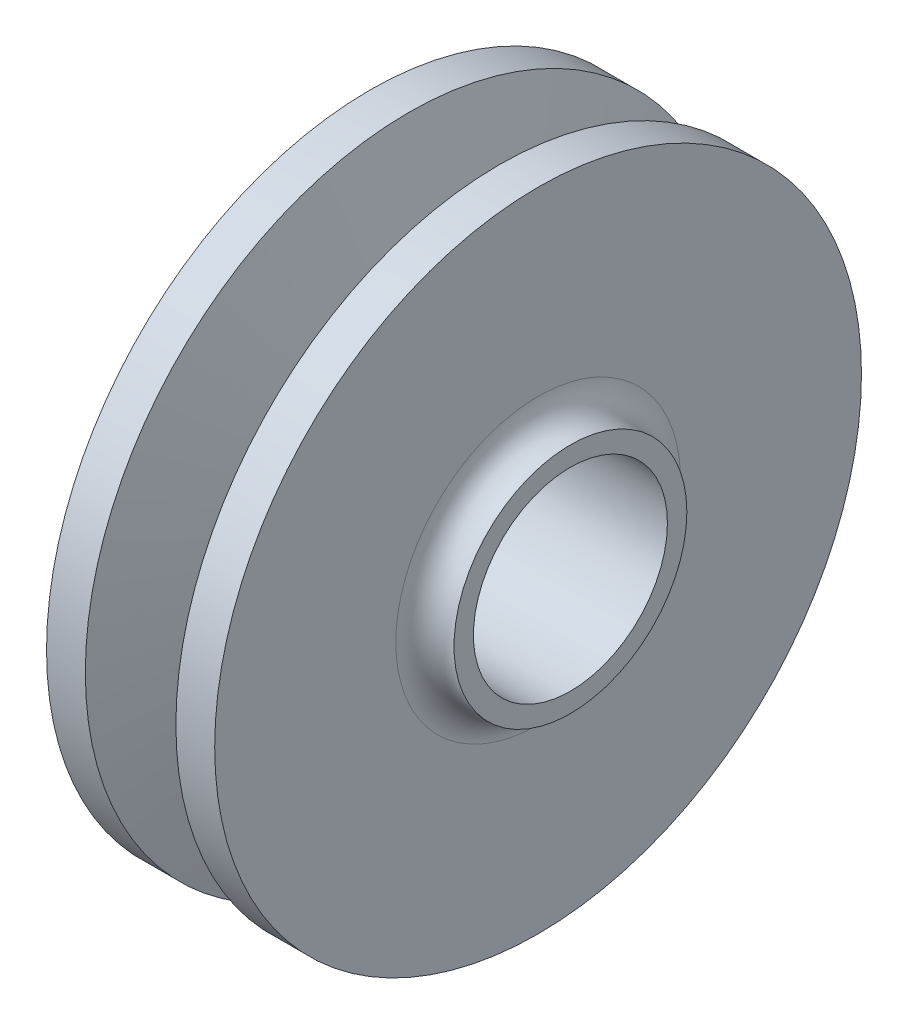
ISO-10303-21;
HEADER;
FILE_DESCRIPTION(('STEP AP214'),'2;1');
FILE_NAME('part.step','',(''),(''),'','','');
FILE_SCHEMA(('AUTOMOTIVE_DESIGN { 1 0 10303 214 1 1 1 1 }'));
ENDSEC;
DATA;
#1=APPLICATION_CONTEXT('core data for automotive mechanical design processes');
#2=APPLICATION_PROTOCOL_DEFINITION('international standard','automotive_design',2000,#1);
#3=PRODUCT_CONTEXT('',#1,'mechanical');
#4=PRODUCT('Part','Part','',(#3));
#5=PRODUCT_RELATED_PRODUCT_CATEGORY('part','',(#4));
#6=PRODUCT_DEFINITION_FORMATION('','',#4);
#7=PRODUCT_DEFINITION_CONTEXT('part definition',#1,'design');
#8=PRODUCT_DEFINITION('design','',#6,#7);
#9=PRODUCT_DEFINITION_SHAPE('','',#8);
#10=(LENGTH_UNIT() NAMED_UNIT(*) SI_UNIT(.MILLI.,.METRE.));
#11=(NAMED_UNIT(*) PLANE_ANGLE_UNIT() SI_UNIT($,.RADIAN.));
#12=(NAMED_UNIT(*) SI_UNIT($,.STERADIAN.) SOLID_ANGLE_UNIT());
#13=UNCERTAINTY_MEASURE_WITH_UNIT(LENGTH_MEASURE(1.E-05),#10,'distance_accuracy_value','');
#14=(GEOMETRIC_REPRESENTATION_CONTEXT(3) GLOBAL_UNCERTAINTY_ASSIGNED_CONTEXT((#13)) GLOBAL_UNIT_ASSIGNED_CONTEXT((#10,
#11,#12)) REPRESENTATION_CONTEXT('',''));
#15=CARTESIAN_POINT('',(0.,0.,0.));
#16=DIRECTION('',(0.,0.,1.));
#17=DIRECTION('',(1.,0.,0.));
#18=AXIS2_PLACEMENT_3D('',#15,#16,#17);
#19=CARTESIAN_POINT('',(18.,15.,0.));
#20=DIRECTION('',(1.,0.,0.));
#21=DIRECTION('',(0.,0.,-1.));
#22=AXIS2_PLACEMENT_3D('',#19,#20,#21);
#23=PLANE('',#22);
#24=CARTESIAN_POINT('',(18.,0.,0.));
#25=DIRECTION('',(1.,0.,0.));
#26=DIRECTION('',(0.,0.,-1.));
#27=AXIS2_PLACEMENT_3D('',#24,#25,#26);
#28=CIRCLE('',#27,18.);
#29=CARTESIAN_POINT('',(18.,0.,-18.));
#30=VERTEX_POINT('',#29);
#31=EDGE_CURVE('E71',#30,#30,#28,.T.);
#32=ORIENTED_EDGE('',*,*,#31,.T.);
#33=EDGE_LOOP('',(#32));
#34=FACE_BOUND('',#33,.T.);
#35=CARTESIAN_POINT('',(18.,0.,0.));
#36=DIRECTION('',(1.,0.,0.));
#37=DIRECTION('',(0.,0.,-1.));
#38=AXIS2_PLACEMENT_3D('',#35,#36,#37);
#39=CIRCLE('',#38,15.);
#40=CARTESIAN_POINT('',(18.,0.,-15.));
#41=VERTEX_POINT('',#40);
#42=EDGE_CURVE('E10',#41,#41,#39,.T.);
#43=ORIENTED_EDGE('',*,*,#42,.F.);
#44=EDGE_LOOP('',(#43));
#45=FACE_BOUND('',#44,.T.);
#46=ADVANCED_FACE('F31',(#34,#45),#23,.T.);
#47=CARTESIAN_POINT('',(38.229944376961,0.,0.));
#48=DIRECTION('',(1.,0.,0.));
#49=DIRECTION('',(0.,0.,-1.));
#50=AXIS2_PLACEMENT_3D('',#47,#48,#49);
#51=CYLINDRICAL_SURFACE('',#50,15.);
#52=ORIENTED_EDGE('',*,*,#42,.T.);
#53=EDGE_LOOP('',(#52));
#54=FACE_BOUND('',#53,.T.);
#55=CARTESIAN_POINT('',(-18.,0.,0.));
#56=DIRECTION('',(1.,0.,0.));
#57=DIRECTION('',(0.,0.,-1.));
#58=AXIS2_PLACEMENT_3D('',#55,#56,#57);
#59=CIRCLE('',#58,15.);
#60=CARTESIAN_POINT('',(-18.,0.,-15.));
#61=VERTEX_POINT('',#60);
#62=EDGE_CURVE('E37',#61,#61,#59,.T.);
#63=ORIENTED_EDGE('',*,*,#62,.F.);
#64=EDGE_LOOP('',(#63));
#65=FACE_BOUND('',#64,.T.);
#66=ADVANCED_FACE('F89',(#54,#65),#51,.F.);
#67=CARTESIAN_POINT('',(-18.,15.,0.));
#68=DIRECTION('',(-1.,0.,0.));
#69=DIRECTION('',(0.,0.,1.));
#70=AXIS2_PLACEMENT_3D('',#67,#68,#69);
#71=PLANE('',#70);
#72=ORIENTED_EDGE('',*,*,#62,.T.);
#73=EDGE_LOOP('',(#72));
#74=FACE_BOUND('',#73,.T.);
#75=CARTESIAN_POINT('',(-18.,0.,0.));
#76=DIRECTION('',(1.,0.,0.));
#77=DIRECTION('',(0.,0.,-1.));
#78=AXIS2_PLACEMENT_3D('',#75,#76,#77);
#79=CIRCLE('',#78,18.);
#80=CARTESIAN_POINT('',(-18.,0.,-18.));
#81=VERTEX_POINT('',#80);
#82=EDGE_CURVE('E41',#81,#81,#79,.T.);
#83=ORIENTED_EDGE('',*,*,#82,.F.);
#84=EDGE_LOOP('',(#83));
#85=FACE_BOUND('',#84,.T.);
#86=ADVANCED_FACE('F93',(#74,#85),#71,.T.);
#87=CARTESIAN_POINT('',(-17.1,0.,0.));
#88=DIRECTION('',(1.,0.,0.));
#89=DIRECTION('',(0.,0.,-1.));
#90=AXIS2_PLACEMENT_3D('',#87,#88,#89);
#91=TOROIDAL_SURFACE('',#90,22.,4.1);
#92=ORIENTED_EDGE('',*,*,#82,.T.);
#93=EDGE_LOOP('',(#92));
#94=FACE_BOUND('',#93,.T.);
#95=CARTESIAN_POINT('',(-13.,0.,0.));
#96=DIRECTION('',(1.,0.,0.));
#97=DIRECTION('',(0.,0.,-1.));
#98=AXIS2_PLACEMENT_3D('',#95,#96,#97);
#99=CIRCLE('',#98,22.);
#100=CARTESIAN_POINT('',(-13.,0.,-22.));
#101=VERTEX_POINT('',#100);
#102=EDGE_CURVE('E45',#101,#101,#99,.T.);
#103=ORIENTED_EDGE('',*,*,#102,.F.);
#104=EDGE_LOOP('',(#103));
#105=FACE_BOUND('',#104,.T.);
#106=ADVANCED_FACE('F97',(#94,#105),#91,.F.);
#107=CARTESIAN_POINT('',(-13.,50.,0.));
#108=DIRECTION('',(-1.,0.,0.));
#109=DIRECTION('',(0.,0.,1.));
#110=AXIS2_PLACEMENT_3D('',#107,#108,#109);
#111=PLANE('',#110);
#112=ORIENTED_EDGE('',*,*,#102,.T.);
#113=EDGE_LOOP('',(#112));
#114=FACE_BOUND('',#113,.T.);
#115=CARTESIAN_POINT('',(-13.,0.,0.));
#116=DIRECTION('',(1.,0.,0.));
#117=DIRECTION('',(0.,0.,-1.));
#118=AXIS2_PLACEMENT_3D('',#115,#116,#117);
#119=CIRCLE('',#118,50.);
#120=CARTESIAN_POINT('',(-13.,0.,-50.));
#121=VERTEX_POINT('',#120);
#122=EDGE_CURVE('E50',#121,#121,#119,.T.);
#123=ORIENTED_EDGE('',*,*,#122,.F.);
#124=EDGE_LOOP('',(#123));
#125=FACE_BOUND('',#124,.T.);
#126=ADVANCED_FACE('F103',(#114,#125),#111,.T.);
#127=CARTESIAN_POINT('',(38.229944376961,0.,0.));
#128=DIRECTION('',(1.,0.,0.));
#129=DIRECTION('',(0.,0.,-1.));
#130=AXIS2_PLACEMENT_3D('',#127,#128,#129);
#131=CYLINDRICAL_SURFACE('',#130,50.);
#132=ORIENTED_EDGE('',*,*,#122,.T.);
#133=EDGE_LOOP('',(#132));
#134=FACE_BOUND('',#133,.T.);
#135=CARTESIAN_POINT('',(-7.,0.,0.));
#136=DIRECTION('',(1.,0.,0.));
#137=DIRECTION('',(0.,0.,-1.));
#138=AXIS2_PLACEMENT_3D('',#135,#136,#137);
#139=CIRCLE('',#138,50.);
#140=CARTESIAN_POINT('',(-7.,0.,-50.));
#141=VERTEX_POINT('',#140);
#142=EDGE_CURVE('E53',#141,#141,#139,.T.);
#143=ORIENTED_EDGE('',*,*,#142,.F.);
#144=EDGE_LOOP('',(#143));
#145=FACE_BOUND('',#144,.T.);
#146=ADVANCED_FACE('F107',(#134,#145),#131,.T.);
#147=CARTESIAN_POINT('',(-3.,0.,0.));
#148=DIRECTION('',(-1.,0.,0.));
#149=DIRECTION('',(0.,0.,1.));
#150=AXIS2_PLACEMENT_3D('',#147,#148,#149);
#151=CONICAL_SURFACE('',#150,35.,1.31019393504756);
#152=ORIENTED_EDGE('',*,*,#142,.T.);
#153=EDGE_LOOP('',(#152));
#154=FACE_BOUND('',#153,.T.);
#155=CARTESIAN_POINT('',(-3.,0.,0.));
#156=DIRECTION('',(1.,0.,0.));
#157=DIRECTION('',(0.,0.,-1.));
#158=AXIS2_PLACEMENT_3D('',#155,#156,#157);
#159=CIRCLE('',#158,35.);
#160=CARTESIAN_POINT('',(-3.,0.,-35.));
#161=VERTEX_POINT('',#160);
#162=EDGE_CURVE('E56',#161,#161,#159,.T.);
#163=ORIENTED_EDGE('',*,*,#162,.F.);
#164=EDGE_LOOP('',(#163));
#165=FACE_BOUND('',#164,.T.);
#166=ADVANCED_FACE('F111',(#154,#165),#151,.T.);
#167=CARTESIAN_POINT('',(38.229944376961,0.,0.));
#168=DIRECTION('',(1.,0.,0.));
#169=DIRECTION('',(0.,0.,-1.));
#170=AXIS2_PLACEMENT_3D('',#167,#168,#169);
#171=CYLINDRICAL_SURFACE('',#170,35.);
#172=ORIENTED_EDGE('',*,*,#162,.T.);
#173=EDGE_LOOP('',(#172));
#174=FACE_BOUND('',#173,.T.);
#175=CARTESIAN_POINT('',(3.,0.,0.));
#176=DIRECTION('',(1.,0.,0.));
#177=DIRECTION('',(0.,0.,-1.));
#178=AXIS2_PLACEMENT_3D('',#175,#176,#177);
#179=CIRCLE('',#178,35.);
#180=CARTESIAN_POINT('',(3.,0.,-35.));
#181=VERTEX_POINT('',#180);
#182=EDGE_CURVE('E59',#181,#181,#179,.T.);
#183=ORIENTED_EDGE('',*,*,#182,.F.);
#184=EDGE_LOOP('',(#183));
#185=FACE_BOUND('',#184,.T.);
#186=ADVANCED_FACE('F115',(#174,#185),#171,.T.);
#187=CARTESIAN_POINT('',(7.,0.,0.));
#188=DIRECTION('',(1.,0.,0.));
#189=DIRECTION('',(0.,0.,-1.));
#190=AXIS2_PLACEMENT_3D('',#187,#188,#189);
#191=CONICAL_SURFACE('',#190,50.,1.31019393504756);
#192=ORIENTED_EDGE('',*,*,#182,.T.);
#193=EDGE_LOOP('',(#192));
#194=FACE_BOUND('',#193,.T.);
#195=CARTESIAN_POINT('',(7.,0.,0.));
#196=DIRECTION('',(1.,0.,0.));
#197=DIRECTION('',(0.,0.,-1.));
#198=AXIS2_PLACEMENT_3D('',#195,#196,#197);
#199=CIRCLE('',#198,50.);
#200=CARTESIAN_POINT('',(7.,0.,-50.));
#201=VERTEX_POINT('',#200);
#202=EDGE_CURVE('E62',#201,#201,#199,.T.);
#203=ORIENTED_EDGE('',*,*,#202,.F.);
#204=EDGE_LOOP('',(#203));
#205=FACE_BOUND('',#204,.T.);
#206=ADVANCED_FACE('F119',(#194,#205),#191,.T.);
#207=CARTESIAN_POINT('',(38.229944376961,0.,0.));
#208=DIRECTION('',(1.,0.,0.));
#209=DIRECTION('',(0.,0.,-1.));
#210=AXIS2_PLACEMENT_3D('',#207,#208,#209);
#211=CYLINDRICAL_SURFACE('',#210,50.);
#212=ORIENTED_EDGE('',*,*,#202,.T.);
#213=EDGE_LOOP('',(#212));
#214=FACE_BOUND('',#213,.T.);
#215=CARTESIAN_POINT('',(13.,0.,0.));
#216=DIRECTION('',(1.,0.,0.));
#217=DIRECTION('',(0.,0.,-1.));
#218=AXIS2_PLACEMENT_3D('',#215,#216,#217);
#219=CIRCLE('',#218,50.);
#220=CARTESIAN_POINT('',(13.,0.,-50.));
#221=VERTEX_POINT('',#220);
#222=EDGE_CURVE('E65',#221,#221,#219,.T.);
#223=ORIENTED_EDGE('',*,*,#222,.F.);
#224=EDGE_LOOP('',(#223));
#225=FACE_BOUND('',#224,.T.);
#226=ADVANCED_FACE('F85',(#214,#225),#211,.T.);
#227=CARTESIAN_POINT('',(13.,50.,0.));
#228=DIRECTION('',(1.,0.,0.));
#229=DIRECTION('',(0.,0.,-1.));
#230=AXIS2_PLACEMENT_3D('',#227,#228,#229);
#231=PLANE('',#230);
#232=ORIENTED_EDGE('',*,*,#222,.T.);
#233=EDGE_LOOP('',(#232));
#234=FACE_BOUND('',#233,.T.);
#235=CARTESIAN_POINT('',(13.,0.,0.));
#236=DIRECTION('',(1.,0.,0.));
#237=DIRECTION('',(0.,0.,-1.));
#238=AXIS2_PLACEMENT_3D('',#235,#236,#237);
#239=CIRCLE('',#238,22.);
#240=CARTESIAN_POINT('',(13.,0.,-22.));
#241=VERTEX_POINT('',#240);
#242=EDGE_CURVE('E68',#241,#241,#239,.T.);
#243=ORIENTED_EDGE('',*,*,#242,.F.);
#244=EDGE_LOOP('',(#243));
#245=FACE_BOUND('',#244,.T.);
#246=ADVANCED_FACE('F79',(#234,#245),#231,.T.);
#247=CARTESIAN_POINT('',(17.1,0.,0.));
#248=DIRECTION('',(1.,0.,0.));
#249=DIRECTION('',(0.,0.,-1.));
#250=AXIS2_PLACEMENT_3D('',#247,#248,#249);
#251=TOROIDAL_SURFACE('',#250,22.,4.1);
#252=ORIENTED_EDGE('',*,*,#242,.T.);
#253=EDGE_LOOP('',(#252));
#254=FACE_BOUND('',#253,.T.);
#255=ORIENTED_EDGE('',*,*,#31,.F.);
#256=EDGE_LOOP('',(#255));
#257=FACE_BOUND('',#256,.T.);
#258=ADVANCED_FACE('F77',(#254,#257),#251,.F.);
#259=CLOSED_SHELL('',(#46,#66,#86,#106,#126,#146,#166,#186,#206,#226,#246,#258));
#260=MANIFOLD_SOLID_BREP('B2',#259);
#261=ADVANCED_BREP_SHAPE_REPRESENTATION('',(#18,#260),#14);
#262=SHAPE_DEFINITION_REPRESENTATION(#9,#261);
ENDSEC;
END-ISO-10303-21;
